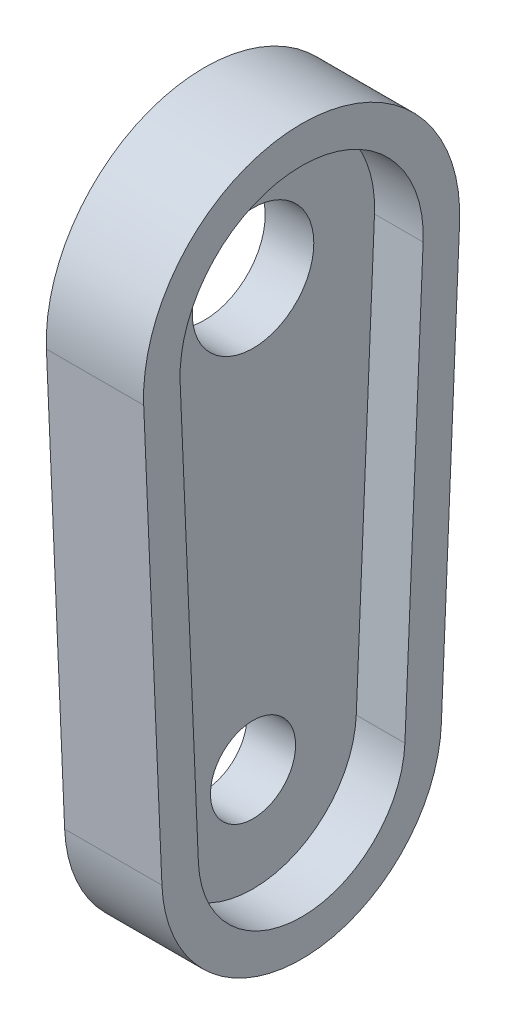
ISO-10303-21;
HEADER;
FILE_DESCRIPTION(('STEP AP214'),'2;1');
FILE_NAME('part.step','',(''),(''),'','','');
FILE_SCHEMA(('AUTOMOTIVE_DESIGN { 1 0 10303 214 1 1 1 1 }'));
ENDSEC;
DATA;
#1=APPLICATION_CONTEXT('core data for automotive mechanical design processes');
#2=APPLICATION_PROTOCOL_DEFINITION('international standard','automotive_design',2000,#1);
#3=PRODUCT_CONTEXT('',#1,'mechanical');
#4=PRODUCT('Part','Part','',(#3));
#5=PRODUCT_RELATED_PRODUCT_CATEGORY('part','',(#4));
#6=PRODUCT_DEFINITION_FORMATION('','',#4);
#7=PRODUCT_DEFINITION_CONTEXT('part definition',#1,'design');
#8=PRODUCT_DEFINITION('design','',#6,#7);
#9=PRODUCT_DEFINITION_SHAPE('','',#8);
#10=(LENGTH_UNIT() NAMED_UNIT(*) SI_UNIT(.MILLI.,.METRE.));
#11=(NAMED_UNIT(*) PLANE_ANGLE_UNIT() SI_UNIT($,.RADIAN.));
#12=(NAMED_UNIT(*) SI_UNIT($,.STERADIAN.) SOLID_ANGLE_UNIT());
#13=UNCERTAINTY_MEASURE_WITH_UNIT(LENGTH_MEASURE(1.E-05),#10,'distance_accuracy_value','');
#14=(GEOMETRIC_REPRESENTATION_CONTEXT(3) GLOBAL_UNCERTAINTY_ASSIGNED_CONTEXT((#13)) GLOBAL_UNIT_ASSIGNED_CONTEXT((#10,
#11,#12)) REPRESENTATION_CONTEXT('',''));
#15=CARTESIAN_POINT('',(0.,0.,0.));
#16=DIRECTION('',(0.,0.,1.));
#17=DIRECTION('',(1.,0.,0.));
#18=AXIS2_PLACEMENT_3D('',#15,#16,#17);
#19=CARTESIAN_POINT('',(4.,0.,0.));
#20=DIRECTION('',(1.,0.,0.));
#21=DIRECTION('',(0.,0.,-1.));
#22=AXIS2_PLACEMENT_3D('',#19,#20,#21);
#23=PLANE('',#22);
#24=CARTESIAN_POINT('',(4.,0.,0.));
#25=DIRECTION('',(1.,0.,0.));
#26=DIRECTION('',(0.,0.,-1.));
#27=AXIS2_PLACEMENT_3D('',#24,#25,#26);
#28=CIRCLE('',#27,5.);
#29=CARTESIAN_POINT('',(4.,0.,-5.));
#30=VERTEX_POINT('',#29);
#31=EDGE_CURVE('E165',#30,#30,#28,.T.);
#32=ORIENTED_EDGE('',*,*,#31,.F.);
#33=EDGE_LOOP('',(#32));
#34=FACE_BOUND('',#33,.T.);
#35=CARTESIAN_POINT('',(4.,-35.,0.));
#36=DIRECTION('',(1.,0.,0.));
#37=DIRECTION('',(0.,0.,-1.));
#38=AXIS2_PLACEMENT_3D('',#35,#36,#37);
#39=CIRCLE('',#38,3.5);
#40=CARTESIAN_POINT('',(4.,-35.,-3.5));
#41=VERTEX_POINT('',#40);
#42=EDGE_CURVE('E162',#41,#41,#39,.T.);
#43=ORIENTED_EDGE('',*,*,#42,.F.);
#44=EDGE_LOOP('',(#43));
#45=FACE_BOUND('',#44,.T.);
#46=CARTESIAN_POINT('',(4.,0.,0.));
#47=DIRECTION('',(1.,0.,0.));
#48=DIRECTION('',(0.,0.,-1.));
#49=AXIS2_PLACEMENT_3D('',#46,#47,#48);
#50=CIRCLE('',#49,10.);
#51=CARTESIAN_POINT('',(4.,-0.428571428571429,9.99081210566049));
#52=VERTEX_POINT('',#51);
#53=CARTESIAN_POINT('',(4.,-0.428571428571424,-9.99081210566049));
#54=VERTEX_POINT('',#53);
#55=EDGE_CURVE('E149',#52,#54,#50,.F.);
#56=ORIENTED_EDGE('',*,*,#55,.F.);
#57=DIRECTION('',(0.,0.999081210566049,0.042857142857143));
#58=VECTOR('',#57,1.);
#59=CARTESIAN_POINT('',(4.,-0.428571428571429,9.99081210566049));
#60=LINE('',#59,#58);
#61=CARTESIAN_POINT('',(4.,-35.3642857142857,8.49219028981141));
#62=VERTEX_POINT('',#61);
#63=EDGE_CURVE('E146',#62,#52,#60,.T.);
#64=ORIENTED_EDGE('',*,*,#63,.F.);
#65=CARTESIAN_POINT('',(4.,-35.,0.));
#66=DIRECTION('',(1.,0.,0.));
#67=DIRECTION('',(0.,0.,-1.));
#68=AXIS2_PLACEMENT_3D('',#65,#66,#67);
#69=CIRCLE('',#68,8.5);
#70=CARTESIAN_POINT('',(4.,-35.3642857142857,-8.49219028981142));
#71=VERTEX_POINT('',#70);
#72=EDGE_CURVE('E123',#71,#62,#69,.F.);
#73=ORIENTED_EDGE('',*,*,#72,.F.);
#74=DIRECTION('',(0.,-0.999081210566049,0.0428571428571428));
#75=VECTOR('',#74,1.);
#76=CARTESIAN_POINT('',(4.,-35.3642857142857,-8.49219028981142));
#77=LINE('',#76,#75);
#78=EDGE_CURVE('E305',#54,#71,#77,.T.);
#79=ORIENTED_EDGE('',*,*,#78,.F.);
#80=EDGE_LOOP('',(#56,#64,#73,#79));
#81=FACE_BOUND('',#80,.T.);
#82=ADVANCED_FACE('F49',(#34,#45,#81),#23,.T.);
#83=CARTESIAN_POINT('',(4.,-0.557142857142858,12.9880557373586));
#84=DIRECTION('',(0.,0.042857142857143,-0.999081210566049));
#85=DIRECTION('',(0.,0.999081210566049,0.042857142857143));
#86=AXIS2_PLACEMENT_3D('',#83,#84,#85);
#87=PLANE('',#86);
#88=DIRECTION('',(0.,-0.999081210566049,-0.042857142857143));
#89=VECTOR('',#88,1.);
#90=CARTESIAN_POINT('',(0.,-0.557142857142858,12.9880557373586));
#91=LINE('',#90,#89);
#92=CARTESIAN_POINT('',(0.,-0.557142857142856,12.9880557373586));
#93=VERTEX_POINT('',#92);
#94=CARTESIAN_POINT('',(0.,-35.4928571428572,11.4894339215096));
#95=VERTEX_POINT('',#94);
#96=EDGE_CURVE('E172',#93,#95,#91,.T.);
#97=ORIENTED_EDGE('',*,*,#96,.T.);
#98=DIRECTION('',(-1.,0.,0.));
#99=VECTOR('',#98,1.);
#100=CARTESIAN_POINT('',(4.,-35.4928571428572,11.4894339215096));
#101=LINE('',#100,#99);
#102=CARTESIAN_POINT('',(8.,-35.4928571428572,11.4894339215096));
#103=VERTEX_POINT('',#102);
#104=EDGE_CURVE('E13',#103,#95,#101,.T.);
#105=ORIENTED_EDGE('',*,*,#104,.F.);
#106=DIRECTION('',(0.,-0.999081210566049,-0.042857142857143));
#107=VECTOR('',#106,1.);
#108=CARTESIAN_POINT('',(8.,-0.557142857142858,12.9880557373586));
#109=LINE('',#108,#107);
#110=CARTESIAN_POINT('',(8.,-0.557142857142856,12.9880557373586));
#111=VERTEX_POINT('',#110);
#112=EDGE_CURVE('E148',#111,#103,#109,.T.);
#113=ORIENTED_EDGE('',*,*,#112,.F.);
#114=DIRECTION('',(-1.,0.,0.));
#115=VECTOR('',#114,1.);
#116=CARTESIAN_POINT('',(4.,-0.557142857142856,12.9880557373586));
#117=LINE('',#116,#115);
#118=EDGE_CURVE('E169',#111,#93,#117,.T.);
#119=ORIENTED_EDGE('',*,*,#118,.T.);
#120=EDGE_LOOP('',(#97,#105,#113,#119));
#121=FACE_BOUND('',#120,.T.);
#122=ADVANCED_FACE('F198',(#121),#87,.F.);
#123=CARTESIAN_POINT('',(4.,-35.,0.));
#124=DIRECTION('',(-1.,0.,0.));
#125=DIRECTION('',(0.,0.,1.));
#126=AXIS2_PLACEMENT_3D('',#123,#124,#125);
#127=CYLINDRICAL_SURFACE('',#126,11.5);
#128=CARTESIAN_POINT('',(0.,-35.,0.));
#129=DIRECTION('',(1.,0.,0.));
#130=DIRECTION('',(0.,0.,-1.));
#131=AXIS2_PLACEMENT_3D('',#128,#129,#130);
#132=CIRCLE('',#131,11.5);
#133=CARTESIAN_POINT('',(0.,-35.4928571428571,-11.4894339215096));
#134=VERTEX_POINT('',#133);
#135=EDGE_CURVE('E175',#95,#134,#132,.T.);
#136=ORIENTED_EDGE('',*,*,#135,.T.);
#137=DIRECTION('',(-1.,0.,0.));
#138=VECTOR('',#137,1.);
#139=CARTESIAN_POINT('',(4.,-35.4928571428571,-11.4894339215096));
#140=LINE('',#139,#138);
#141=CARTESIAN_POINT('',(8.,-35.4928571428571,-11.4894339215096));
#142=VERTEX_POINT('',#141);
#143=EDGE_CURVE('E57',#142,#134,#140,.T.);
#144=ORIENTED_EDGE('',*,*,#143,.F.);
#145=CARTESIAN_POINT('',(8.,-35.,0.));
#146=DIRECTION('',(1.,0.,0.));
#147=DIRECTION('',(0.,0.,-1.));
#148=AXIS2_PLACEMENT_3D('',#145,#146,#147);
#149=CIRCLE('',#148,11.5);
#150=EDGE_CURVE('E152',#103,#142,#149,.T.);
#151=ORIENTED_EDGE('',*,*,#150,.F.);
#152=ORIENTED_EDGE('',*,*,#104,.T.);
#153=EDGE_LOOP('',(#136,#144,#151,#152));
#154=FACE_BOUND('',#153,.T.);
#155=ADVANCED_FACE('F192',(#154),#127,.T.);
#156=CARTESIAN_POINT('',(4.,-0.557142857142855,-12.9880557373586));
#157=DIRECTION('',(0.,-0.0428571428571427,-0.999081210566049));
#158=DIRECTION('',(0.,0.999081210566049,-0.0428571428571427));
#159=AXIS2_PLACEMENT_3D('',#156,#157,#158);
#160=PLANE('',#159);
#161=DIRECTION('',(0.,-0.999081210566049,0.0428571428571427));
#162=VECTOR('',#161,1.);
#163=CARTESIAN_POINT('',(0.,-0.557142857142855,-12.9880557373586));
#164=LINE('',#163,#162);
#165=CARTESIAN_POINT('',(0.,-0.557142857142855,-12.9880557373586));
#166=VERTEX_POINT('',#165);
#167=EDGE_CURVE('E178',#166,#134,#164,.T.);
#168=ORIENTED_EDGE('',*,*,#167,.F.);
#169=DIRECTION('',(-1.,0.,0.));
#170=VECTOR('',#169,1.);
#171=CARTESIAN_POINT('',(4.,-0.557142857142855,-12.9880557373586));
#172=LINE('',#171,#170);
#173=CARTESIAN_POINT('',(8.,-0.557142857142855,-12.9880557373586));
#174=VERTEX_POINT('',#173);
#175=EDGE_CURVE('E185',#174,#166,#172,.T.);
#176=ORIENTED_EDGE('',*,*,#175,.F.);
#177=DIRECTION('',(0.,-0.999081210566049,0.0428571428571427));
#178=VECTOR('',#177,1.);
#179=CARTESIAN_POINT('',(8.,-0.557142857142855,-12.9880557373586));
#180=LINE('',#179,#178);
#181=EDGE_CURVE('E155',#174,#142,#180,.T.);
#182=ORIENTED_EDGE('',*,*,#181,.T.);
#183=ORIENTED_EDGE('',*,*,#143,.T.);
#184=EDGE_LOOP('',(#168,#176,#182,#183));
#185=FACE_BOUND('',#184,.T.);
#186=ADVANCED_FACE('F188',(#185),#160,.T.);
#187=CARTESIAN_POINT('',(4.,0.,0.));
#188=DIRECTION('',(-1.,0.,0.));
#189=DIRECTION('',(0.,0.,1.));
#190=AXIS2_PLACEMENT_3D('',#187,#188,#189);
#191=CYLINDRICAL_SURFACE('',#190,13.);
#192=CARTESIAN_POINT('',(0.,0.,0.));
#193=DIRECTION('',(1.,0.,0.));
#194=DIRECTION('',(0.,0.,-1.));
#195=AXIS2_PLACEMENT_3D('',#192,#193,#194);
#196=CIRCLE('',#195,13.);
#197=EDGE_CURVE('E72',#166,#93,#196,.T.);
#198=ORIENTED_EDGE('',*,*,#197,.T.);
#199=ORIENTED_EDGE('',*,*,#118,.F.);
#200=CARTESIAN_POINT('',(8.,0.,0.));
#201=DIRECTION('',(1.,0.,0.));
#202=DIRECTION('',(0.,0.,-1.));
#203=AXIS2_PLACEMENT_3D('',#200,#201,#202);
#204=CIRCLE('',#203,13.);
#205=EDGE_CURVE('E158',#174,#111,#204,.T.);
#206=ORIENTED_EDGE('',*,*,#205,.F.);
#207=ORIENTED_EDGE('',*,*,#175,.T.);
#208=EDGE_LOOP('',(#198,#199,#206,#207));
#209=FACE_BOUND('',#208,.T.);
#210=ADVANCED_FACE('F201',(#209),#191,.T.);
#211=CARTESIAN_POINT('',(4.,-35.,0.));
#212=DIRECTION('',(-1.,0.,0.));
#213=DIRECTION('',(0.,0.,1.));
#214=AXIS2_PLACEMENT_3D('',#211,#212,#213);
#215=CYLINDRICAL_SURFACE('',#214,3.5);
#216=ORIENTED_EDGE('',*,*,#42,.T.);
#217=EDGE_LOOP('',(#216));
#218=FACE_BOUND('',#217,.T.);
#219=CARTESIAN_POINT('',(0.,-35.,0.));
#220=DIRECTION('',(1.,0.,0.));
#221=DIRECTION('',(0.,0.,-1.));
#222=AXIS2_PLACEMENT_3D('',#219,#220,#221);
#223=CIRCLE('',#222,3.5);
#224=CARTESIAN_POINT('',(0.,-35.,-3.5));
#225=VERTEX_POINT('',#224);
#226=EDGE_CURVE('E161',#225,#225,#223,.T.);
#227=ORIENTED_EDGE('',*,*,#226,.F.);
#228=EDGE_LOOP('',(#227));
#229=FACE_BOUND('',#228,.T.);
#230=ADVANCED_FACE('F51',(#218,#229),#215,.F.);
#231=CARTESIAN_POINT('',(4.,0.,0.));
#232=DIRECTION('',(-1.,0.,0.));
#233=DIRECTION('',(0.,0.,1.));
#234=AXIS2_PLACEMENT_3D('',#231,#232,#233);
#235=CYLINDRICAL_SURFACE('',#234,5.);
#236=ORIENTED_EDGE('',*,*,#31,.T.);
#237=EDGE_LOOP('',(#236));
#238=FACE_BOUND('',#237,.T.);
#239=CARTESIAN_POINT('',(0.,0.,0.));
#240=DIRECTION('',(1.,0.,0.));
#241=DIRECTION('',(0.,0.,-1.));
#242=AXIS2_PLACEMENT_3D('',#239,#240,#241);
#243=CIRCLE('',#242,5.);
#244=CARTESIAN_POINT('',(0.,0.,-5.));
#245=VERTEX_POINT('',#244);
#246=EDGE_CURVE('E166',#245,#245,#243,.T.);
#247=ORIENTED_EDGE('',*,*,#246,.F.);
#248=EDGE_LOOP('',(#247));
#249=FACE_BOUND('',#248,.T.);
#250=ADVANCED_FACE('F211',(#238,#249),#235,.F.);
#251=CARTESIAN_POINT('',(0.,0.,0.));
#252=DIRECTION('',(1.,0.,0.));
#253=DIRECTION('',(0.,0.,-1.));
#254=AXIS2_PLACEMENT_3D('',#251,#252,#253);
#255=PLANE('',#254);
#256=ORIENTED_EDGE('',*,*,#96,.F.);
#257=ORIENTED_EDGE('',*,*,#197,.F.);
#258=ORIENTED_EDGE('',*,*,#167,.T.);
#259=ORIENTED_EDGE('',*,*,#135,.F.);
#260=EDGE_LOOP('',(#256,#257,#258,#259));
#261=FACE_BOUND('',#260,.T.);
#262=ORIENTED_EDGE('',*,*,#246,.T.);
#263=EDGE_LOOP('',(#262));
#264=FACE_BOUND('',#263,.T.);
#265=ORIENTED_EDGE('',*,*,#226,.T.);
#266=EDGE_LOOP('',(#265));
#267=FACE_BOUND('',#266,.T.);
#268=ADVANCED_FACE('F195',(#261,#264,#267),#255,.F.);
#269=CARTESIAN_POINT('',(8.,0.,0.));
#270=DIRECTION('',(1.,0.,0.));
#271=DIRECTION('',(0.,0.,-1.));
#272=AXIS2_PLACEMENT_3D('',#269,#270,#271);
#273=PLANE('',#272);
#274=CARTESIAN_POINT('',(8.,0.,0.));
#275=DIRECTION('',(1.,0.,0.));
#276=DIRECTION('',(0.,0.,-1.));
#277=AXIS2_PLACEMENT_3D('',#274,#275,#276);
#278=CIRCLE('',#277,10.);
#279=CARTESIAN_POINT('',(8.,-0.428571428571426,-9.99081210566049));
#280=VERTEX_POINT('',#279);
#281=CARTESIAN_POINT('',(8.,-0.428571428571429,9.99081210566049));
#282=VERTEX_POINT('',#281);
#283=EDGE_CURVE('E64',#280,#282,#278,.T.);
#284=ORIENTED_EDGE('',*,*,#283,.F.);
#285=DIRECTION('',(0.,0.999081210566049,-0.0428571428571428));
#286=VECTOR('',#285,1.);
#287=CARTESIAN_POINT('',(8.,-35.3642857142857,-8.49219028981142));
#288=LINE('',#287,#286);
#289=CARTESIAN_POINT('',(8.,-35.3642857142857,-8.49219028981142));
#290=VERTEX_POINT('',#289);
#291=EDGE_CURVE('E137',#290,#280,#288,.T.);
#292=ORIENTED_EDGE('',*,*,#291,.F.);
#293=CARTESIAN_POINT('',(8.,-35.,0.));
#294=DIRECTION('',(1.,0.,0.));
#295=DIRECTION('',(0.,0.,-1.));
#296=AXIS2_PLACEMENT_3D('',#293,#294,#295);
#297=CIRCLE('',#296,8.5);
#298=CARTESIAN_POINT('',(8.,-35.3642857142857,8.49219028981141));
#299=VERTEX_POINT('',#298);
#300=EDGE_CURVE('E120',#299,#290,#297,.T.);
#301=ORIENTED_EDGE('',*,*,#300,.F.);
#302=DIRECTION('',(0.,-0.999081210566049,-0.042857142857143));
#303=VECTOR('',#302,1.);
#304=CARTESIAN_POINT('',(8.,-0.428571428571429,9.99081210566049));
#305=LINE('',#304,#303);
#306=EDGE_CURVE('E130',#282,#299,#305,.T.);
#307=ORIENTED_EDGE('',*,*,#306,.F.);
#308=EDGE_LOOP('',(#284,#292,#301,#307));
#309=FACE_BOUND('',#308,.T.);
#310=ORIENTED_EDGE('',*,*,#112,.T.);
#311=ORIENTED_EDGE('',*,*,#150,.T.);
#312=ORIENTED_EDGE('',*,*,#181,.F.);
#313=ORIENTED_EDGE('',*,*,#205,.T.);
#314=EDGE_LOOP('',(#310,#311,#312,#313));
#315=FACE_BOUND('',#314,.T.);
#316=ADVANCED_FACE('F134',(#309,#315),#273,.T.);
#317=CARTESIAN_POINT('',(-53.1161098115059,0.,0.));
#318=DIRECTION('',(1.,0.,0.));
#319=DIRECTION('',(0.,0.,-1.));
#320=AXIS2_PLACEMENT_3D('',#317,#318,#319);
#321=CYLINDRICAL_SURFACE('',#320,10.);
#322=ORIENTED_EDGE('',*,*,#55,.T.);
#323=DIRECTION('',(1.,0.,0.));
#324=VECTOR('',#323,1.);
#325=CARTESIAN_POINT('',(-53.1161098115059,-0.428571428571426,-9.99081210566049));
#326=LINE('',#325,#324);
#327=EDGE_CURVE('E142',#54,#280,#326,.T.);
#328=ORIENTED_EDGE('',*,*,#327,.T.);
#329=ORIENTED_EDGE('',*,*,#283,.T.);
#330=DIRECTION('',(1.,0.,0.));
#331=VECTOR('',#330,1.);
#332=CARTESIAN_POINT('',(-53.1161098115059,-0.428571428571429,9.99081210566049));
#333=LINE('',#332,#331);
#334=EDGE_CURVE('E127',#52,#282,#333,.T.);
#335=ORIENTED_EDGE('',*,*,#334,.F.);
#336=EDGE_LOOP('',(#322,#328,#329,#335));
#337=FACE_BOUND('',#336,.T.);
#338=ADVANCED_FACE('F203',(#337),#321,.F.);
#339=CARTESIAN_POINT('',(-53.1161098115059,-35.3642857142857,-8.49219028981142));
#340=DIRECTION('',(0.,-0.0428571428571428,-0.999081210566049));
#341=DIRECTION('',(0.,0.999081210566049,-0.0428571428571428));
#342=AXIS2_PLACEMENT_3D('',#339,#340,#341);
#343=PLANE('',#342);
#344=ORIENTED_EDGE('',*,*,#78,.T.);
#345=DIRECTION('',(1.,0.,0.));
#346=VECTOR('',#345,1.);
#347=CARTESIAN_POINT('',(-53.1161098115059,-35.3642857142857,-8.49219028981142));
#348=LINE('',#347,#346);
#349=EDGE_CURVE('E126',#71,#290,#348,.T.);
#350=ORIENTED_EDGE('',*,*,#349,.T.);
#351=ORIENTED_EDGE('',*,*,#291,.T.);
#352=ORIENTED_EDGE('',*,*,#327,.F.);
#353=EDGE_LOOP('',(#344,#350,#351,#352));
#354=FACE_BOUND('',#353,.T.);
#355=ADVANCED_FACE('F209',(#354),#343,.F.);
#356=CARTESIAN_POINT('',(-53.1161098115059,-35.,0.));
#357=DIRECTION('',(1.,0.,0.));
#358=DIRECTION('',(0.,0.,-1.));
#359=AXIS2_PLACEMENT_3D('',#356,#357,#358);
#360=CYLINDRICAL_SURFACE('',#359,8.5);
#361=ORIENTED_EDGE('',*,*,#72,.T.);
#362=DIRECTION('',(1.,0.,0.));
#363=VECTOR('',#362,1.);
#364=CARTESIAN_POINT('',(-53.1161098115059,-35.3642857142857,8.49219028981141));
#365=LINE('',#364,#363);
#366=EDGE_CURVE('E115',#62,#299,#365,.T.);
#367=ORIENTED_EDGE('',*,*,#366,.T.);
#368=ORIENTED_EDGE('',*,*,#300,.T.);
#369=ORIENTED_EDGE('',*,*,#349,.F.);
#370=EDGE_LOOP('',(#361,#367,#368,#369));
#371=FACE_BOUND('',#370,.T.);
#372=ADVANCED_FACE('F117',(#371),#360,.F.);
#373=CARTESIAN_POINT('',(-53.1161098115059,-0.428571428571429,9.99081210566049));
#374=DIRECTION('',(0.,-0.042857142857143,0.999081210566049));
#375=DIRECTION('',(0.,-0.999081210566049,-0.042857142857143));
#376=AXIS2_PLACEMENT_3D('',#373,#374,#375);
#377=PLANE('',#376);
#378=ORIENTED_EDGE('',*,*,#63,.T.);
#379=ORIENTED_EDGE('',*,*,#334,.T.);
#380=ORIENTED_EDGE('',*,*,#306,.T.);
#381=ORIENTED_EDGE('',*,*,#366,.F.);
#382=EDGE_LOOP('',(#378,#379,#380,#381));
#383=FACE_BOUND('',#382,.T.);
#384=ADVANCED_FACE('F131',(#383),#377,.F.);
#385=CLOSED_SHELL('',(#82,#122,#155,#186,#210,#230,#250,#268,#316,#338,#355,#372,#384));
#386=MANIFOLD_SOLID_BREP('B2',#385);
#387=ADVANCED_BREP_SHAPE_REPRESENTATION('',(#18,#386),#14);
#388=SHAPE_DEFINITION_REPRESENTATION(#9,#387);
ENDSEC;
END-ISO-10303-21;
